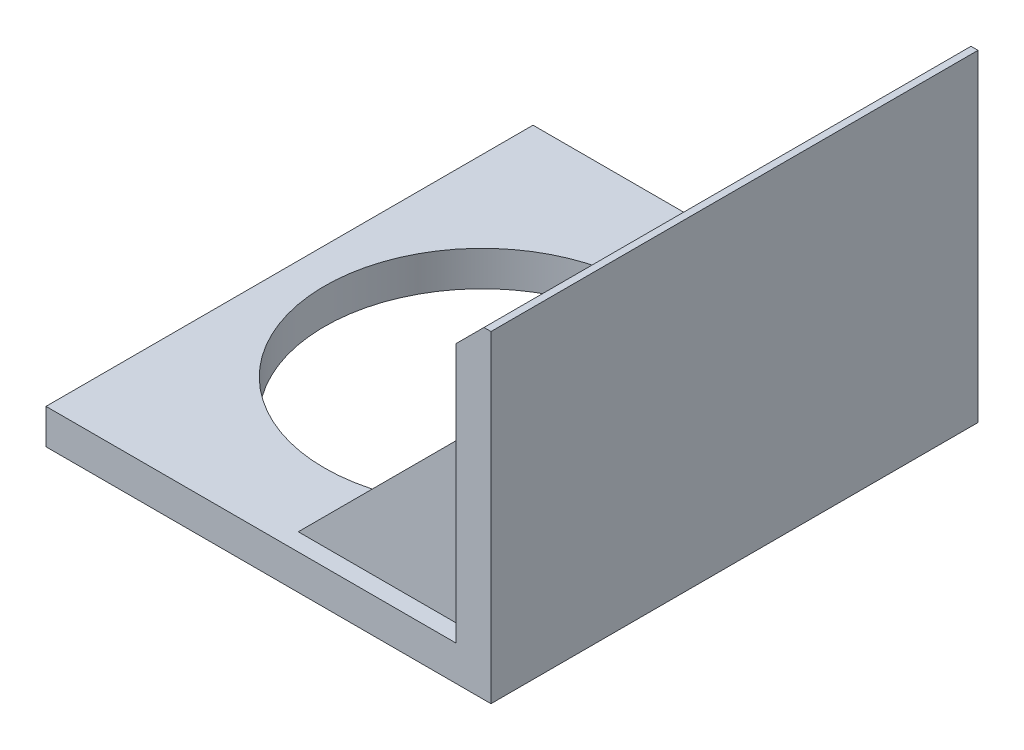
ISO-10303-21;
HEADER;
FILE_DESCRIPTION(('STEP AP214'),'2;1');
FILE_NAME('part.step','',(''),(''),'','','');
FILE_SCHEMA(('AUTOMOTIVE_DESIGN { 1 0 10303 214 1 1 1 1 }'));
ENDSEC;
DATA;
#1=APPLICATION_CONTEXT('core data for automotive mechanical design processes');
#2=APPLICATION_PROTOCOL_DEFINITION('international standard','automotive_design',2000,#1);
#3=PRODUCT_CONTEXT('',#1,'mechanical');
#4=PRODUCT('Part','Part','',(#3));
#5=PRODUCT_RELATED_PRODUCT_CATEGORY('part','',(#4));
#6=PRODUCT_DEFINITION_FORMATION('','',#4);
#7=PRODUCT_DEFINITION_CONTEXT('part definition',#1,'design');
#8=PRODUCT_DEFINITION('design','',#6,#7);
#9=PRODUCT_DEFINITION_SHAPE('','',#8);
#10=(LENGTH_UNIT() NAMED_UNIT(*) SI_UNIT(.MILLI.,.METRE.));
#11=(NAMED_UNIT(*) PLANE_ANGLE_UNIT() SI_UNIT($,.RADIAN.));
#12=(NAMED_UNIT(*) SI_UNIT($,.STERADIAN.) SOLID_ANGLE_UNIT());
#13=UNCERTAINTY_MEASURE_WITH_UNIT(LENGTH_MEASURE(1.E-05),#10,'distance_accuracy_value','');
#14=(GEOMETRIC_REPRESENTATION_CONTEXT(3) GLOBAL_UNCERTAINTY_ASSIGNED_CONTEXT((#13)) GLOBAL_UNIT_ASSIGNED_CONTEXT((#10,
#11,#12)) REPRESENTATION_CONTEXT('',''));
#15=CARTESIAN_POINT('',(0.,0.,0.));
#16=DIRECTION('',(0.,0.,1.));
#17=DIRECTION('',(1.,0.,0.));
#18=AXIS2_PLACEMENT_3D('',#15,#16,#17);
#19=CARTESIAN_POINT('',(0.,10.,0.));
#20=DIRECTION('',(0.,-1.,0.));
#21=DIRECTION('',(0.,0.,-1.));
#22=AXIS2_PLACEMENT_3D('',#19,#20,#21);
#23=PLANE('',#22);
#24=CARTESIAN_POINT('',(0.,10.,0.));
#25=DIRECTION('',(0.,1.,0.));
#26=DIRECTION('',(0.,0.,1.));
#27=AXIS2_PLACEMENT_3D('',#24,#25,#26);
#28=CIRCLE('',#27,45.);
#29=CARTESIAN_POINT('',(0.,10.,45.));
#30=VERTEX_POINT('',#29);
#31=EDGE_CURVE('E198',#30,#30,#28,.T.);
#32=ORIENTED_EDGE('',*,*,#31,.F.);
#33=EDGE_LOOP('',(#32));
#34=FACE_BOUND('',#33,.T.);
#35=DIRECTION('',(1.,0.,0.));
#36=VECTOR('',#35,1.);
#37=CARTESIAN_POINT('',(12.0000000000035,10.,-64.4999999999999));
#38=LINE('',#37,#36);
#39=CARTESIAN_POINT('',(12.0000000000035,10.,-64.4999999999999));
#40=VERTEX_POINT('',#39);
#41=CARTESIAN_POINT('',(62.0000000000035,10.,-64.4999999999999));
#42=VERTEX_POINT('',#41);
#43=EDGE_CURVE('E137',#40,#42,#38,.T.);
#44=ORIENTED_EDGE('',*,*,#43,.T.);
#45=DIRECTION('',(0.,0.,1.));
#46=VECTOR('',#45,1.);
#47=CARTESIAN_POINT('',(62.0000000000035,10.,-69.5000000000001));
#48=LINE('',#47,#46);
#49=CARTESIAN_POINT('',(62.0000000000035,10.,-69.5000000000001));
#50=VERTEX_POINT('',#49);
#51=EDGE_CURVE('E185',#50,#42,#48,.T.);
#52=ORIENTED_EDGE('',*,*,#51,.F.);
#53=DIRECTION('',(-1.,0.,0.));
#54=VECTOR('',#53,1.);
#55=CARTESIAN_POINT('',(3.49148133884313E-12,10.,-69.5000000000001));
#56=LINE('',#55,#54);
#57=CARTESIAN_POINT('',(-54.9999999999965,10.,-69.5));
#58=VERTEX_POINT('',#57);
#59=EDGE_CURVE('E204',#50,#58,#56,.T.);
#60=ORIENTED_EDGE('',*,*,#59,.T.);
#61=DIRECTION('',(0.,0.,1.));
#62=VECTOR('',#61,1.);
#63=CARTESIAN_POINT('',(-54.9999999999965,10.,-69.5));
#64=LINE('',#63,#62);
#65=CARTESIAN_POINT('',(-54.9999999999965,10.,69.5));
#66=VERTEX_POINT('',#65);
#67=EDGE_CURVE('E206',#58,#66,#64,.T.);
#68=ORIENTED_EDGE('',*,*,#67,.T.);
#69=DIRECTION('',(1.,0.,0.));
#70=VECTOR('',#69,1.);
#71=CARTESIAN_POINT('',(3.49148133884313E-12,10.,69.5000000000001));
#72=LINE('',#71,#70);
#73=CARTESIAN_POINT('',(62.0000000000035,10.,69.5000000000001));
#74=VERTEX_POINT('',#73);
#75=EDGE_CURVE('E209',#66,#74,#72,.T.);
#76=ORIENTED_EDGE('',*,*,#75,.T.);
#77=CARTESIAN_POINT('',(62.0000000000035,10.,64.5000000000001));
#78=VERTEX_POINT('',#77);
#79=EDGE_CURVE('E179',#78,#74,#48,.T.);
#80=ORIENTED_EDGE('',*,*,#79,.F.);
#81=DIRECTION('',(1.,0.,0.));
#82=VECTOR('',#81,1.);
#83=CARTESIAN_POINT('',(12.0000000000035,10.,64.5000000000001));
#84=LINE('',#83,#82);
#85=CARTESIAN_POINT('',(12.0000000000035,10.,64.5000000000001));
#86=VERTEX_POINT('',#85);
#87=EDGE_CURVE('E62',#86,#78,#84,.T.);
#88=ORIENTED_EDGE('',*,*,#87,.F.);
#89=DIRECTION('',(0.,0.,1.));
#90=VECTOR('',#89,1.);
#91=CARTESIAN_POINT('',(12.0000000000035,10.,56.5000000000001));
#92=LINE('',#91,#90);
#93=CARTESIAN_POINT('',(12.0000000000035,10.,56.5000000000001));
#94=VERTEX_POINT('',#93);
#95=EDGE_CURVE('E172',#94,#86,#92,.T.);
#96=ORIENTED_EDGE('',*,*,#95,.F.);
#97=DIRECTION('',(1.,0.,0.));
#98=VECTOR('',#97,1.);
#99=CARTESIAN_POINT('',(12.0000000000035,10.,56.5000000000001));
#100=LINE('',#99,#98);
#101=CARTESIAN_POINT('',(62.0000000000035,10.,56.5000000000001));
#102=VERTEX_POINT('',#101);
#103=EDGE_CURVE('E165',#94,#102,#100,.T.);
#104=ORIENTED_EDGE('',*,*,#103,.T.);
#105=CARTESIAN_POINT('',(62.0000000000035,10.,-56.4999999999999));
#106=VERTEX_POINT('',#105);
#107=EDGE_CURVE('E192',#106,#102,#48,.T.);
#108=ORIENTED_EDGE('',*,*,#107,.F.);
#109=DIRECTION('',(1.,0.,0.));
#110=VECTOR('',#109,1.);
#111=CARTESIAN_POINT('',(12.0000000000035,10.,-56.4999999999999));
#112=LINE('',#111,#110);
#113=CARTESIAN_POINT('',(12.0000000000035,10.,-56.4999999999999));
#114=VERTEX_POINT('',#113);
#115=EDGE_CURVE('E54',#114,#106,#112,.T.);
#116=ORIENTED_EDGE('',*,*,#115,.F.);
#117=DIRECTION('',(0.,0.,1.));
#118=VECTOR('',#117,1.);
#119=CARTESIAN_POINT('',(12.0000000000035,10.,-64.4999999999999));
#120=LINE('',#119,#118);
#121=EDGE_CURVE('E150',#40,#114,#120,.T.);
#122=ORIENTED_EDGE('',*,*,#121,.F.);
#123=EDGE_LOOP('',(#44,#52,#60,#68,#76,#80,#88,#96,#104,#108,#116,#122));
#124=FACE_BOUND('',#123,.T.);
#125=ADVANCED_FACE('F39',(#34,#124),#23,.F.);
#126=CARTESIAN_POINT('',(62.0000000000035,92.,-69.5000000000001));
#127=DIRECTION('',(1.,0.,0.));
#128=DIRECTION('',(0.,0.,-1.));
#129=AXIS2_PLACEMENT_3D('',#126,#127,#128);
#130=PLANE('',#129);
#131=DIRECTION('',(0.,1.,0.));
#132=VECTOR('',#131,1.);
#133=CARTESIAN_POINT('',(62.0000000000035,10.,-64.4999999999999));
#134=LINE('',#133,#132);
#135=CARTESIAN_POINT('',(62.0000000000035,60.,-64.4999999999999));
#136=VERTEX_POINT('',#135);
#137=EDGE_CURVE('E142',#42,#136,#134,.T.);
#138=ORIENTED_EDGE('',*,*,#137,.T.);
#139=DIRECTION('',(0.,0.,1.));
#140=VECTOR('',#139,1.);
#141=CARTESIAN_POINT('',(62.0000000000035,60.,-64.4999999999999));
#142=LINE('',#141,#140);
#143=CARTESIAN_POINT('',(62.0000000000035,60.,-56.4999999999999));
#144=VERTEX_POINT('',#143);
#145=EDGE_CURVE('E152',#136,#144,#142,.T.);
#146=ORIENTED_EDGE('',*,*,#145,.T.);
#147=DIRECTION('',(0.,1.,0.));
#148=VECTOR('',#147,1.);
#149=CARTESIAN_POINT('',(62.0000000000035,10.,-56.4999999999999));
#150=LINE('',#149,#148);
#151=EDGE_CURVE('E153',#106,#144,#150,.T.);
#152=ORIENTED_EDGE('',*,*,#151,.F.);
#153=ORIENTED_EDGE('',*,*,#107,.T.);
#154=DIRECTION('',(0.,1.,0.));
#155=VECTOR('',#154,1.);
#156=CARTESIAN_POINT('',(62.0000000000035,10.,56.5000000000001));
#157=LINE('',#156,#155);
#158=CARTESIAN_POINT('',(62.0000000000035,60.,56.5000000000001));
#159=VERTEX_POINT('',#158);
#160=EDGE_CURVE('E169',#102,#159,#157,.T.);
#161=ORIENTED_EDGE('',*,*,#160,.T.);
#162=DIRECTION('',(0.,0.,1.));
#163=VECTOR('',#162,1.);
#164=CARTESIAN_POINT('',(62.0000000000035,60.,56.5000000000001));
#165=LINE('',#164,#163);
#166=CARTESIAN_POINT('',(62.0000000000035,60.,64.5000000000001));
#167=VERTEX_POINT('',#166);
#168=EDGE_CURVE('E176',#159,#167,#165,.T.);
#169=ORIENTED_EDGE('',*,*,#168,.T.);
#170=DIRECTION('',(0.,1.,0.));
#171=VECTOR('',#170,1.);
#172=CARTESIAN_POINT('',(62.0000000000035,10.,64.5000000000001));
#173=LINE('',#172,#171);
#174=EDGE_CURVE('E166',#78,#167,#173,.T.);
#175=ORIENTED_EDGE('',*,*,#174,.F.);
#176=ORIENTED_EDGE('',*,*,#79,.T.);
#177=DIRECTION('',(0.,-1.,0.));
#178=VECTOR('',#177,1.);
#179=CARTESIAN_POINT('',(62.0000000000035,92.,69.5000000000001));
#180=LINE('',#179,#178);
#181=CARTESIAN_POINT('',(62.0000000000035,84.,69.5000000000001));
#182=VERTEX_POINT('',#181);
#183=EDGE_CURVE('E190',#182,#74,#180,.T.);
#184=ORIENTED_EDGE('',*,*,#183,.F.);
#185=DIRECTION('',(0.,0.,-1.));
#186=VECTOR('',#185,1.);
#187=CARTESIAN_POINT('',(62.0000000000035,84.,-69.5000000000001));
#188=LINE('',#187,#186);
#189=CARTESIAN_POINT('',(62.0000000000035,84.,-69.5000000000001));
#190=VERTEX_POINT('',#189);
#191=EDGE_CURVE('E47',#182,#190,#188,.T.);
#192=ORIENTED_EDGE('',*,*,#191,.T.);
#193=DIRECTION('',(0.,-1.,0.));
#194=VECTOR('',#193,1.);
#195=CARTESIAN_POINT('',(62.0000000000035,92.,-69.5000000000001));
#196=LINE('',#195,#194);
#197=EDGE_CURVE('E195',#190,#50,#196,.T.);
#198=ORIENTED_EDGE('',*,*,#197,.T.);
#199=ORIENTED_EDGE('',*,*,#51,.T.);
#200=EDGE_LOOP('',(#138,#146,#152,#153,#161,#169,#175,#176,#184,#192,#198,#199));
#201=FACE_BOUND('',#200,.T.);
#202=ADVANCED_FACE('F240',(#201),#130,.F.);
#203=CARTESIAN_POINT('',(0.,0.,0.));
#204=DIRECTION('',(0.,-1.,0.));
#205=DIRECTION('',(0.,0.,-1.));
#206=AXIS2_PLACEMENT_3D('',#203,#204,#205);
#207=PLANE('',#206);
#208=DIRECTION('',(-1.,0.,0.));
#209=VECTOR('',#208,1.);
#210=CARTESIAN_POINT('',(3.49148133884313E-12,0.,-69.5000000000001));
#211=LINE('',#210,#209);
#212=CARTESIAN_POINT('',(72.0000000000035,0.,-69.5000000000001));
#213=VERTEX_POINT('',#212);
#214=CARTESIAN_POINT('',(-54.9999999999965,0.,-69.5));
#215=VERTEX_POINT('',#214);
#216=EDGE_CURVE('E201',#213,#215,#211,.T.);
#217=ORIENTED_EDGE('',*,*,#216,.F.);
#218=DIRECTION('',(0.,0.,-1.));
#219=VECTOR('',#218,1.);
#220=CARTESIAN_POINT('',(72.0000000000035,0.,-69.5000000000001));
#221=LINE('',#220,#219);
#222=CARTESIAN_POINT('',(72.0000000000035,0.,69.5000000000001));
#223=VERTEX_POINT('',#222);
#224=EDGE_CURVE('E207',#223,#213,#221,.T.);
#225=ORIENTED_EDGE('',*,*,#224,.F.);
#226=DIRECTION('',(1.,0.,0.));
#227=VECTOR('',#226,1.);
#228=CARTESIAN_POINT('',(3.49148133884313E-12,0.,69.5000000000001));
#229=LINE('',#228,#227);
#230=CARTESIAN_POINT('',(-54.9999999999965,0.,69.5));
#231=VERTEX_POINT('',#230);
#232=EDGE_CURVE('E217',#231,#223,#229,.T.);
#233=ORIENTED_EDGE('',*,*,#232,.F.);
#234=DIRECTION('',(0.,0.,1.));
#235=VECTOR('',#234,1.);
#236=CARTESIAN_POINT('',(-54.9999999999965,0.,-69.5));
#237=LINE('',#236,#235);
#238=EDGE_CURVE('E214',#215,#231,#237,.T.);
#239=ORIENTED_EDGE('',*,*,#238,.F.);
#240=EDGE_LOOP('',(#217,#225,#233,#239));
#241=FACE_BOUND('',#240,.T.);
#242=CARTESIAN_POINT('',(0.,0.,0.));
#243=DIRECTION('',(0.,1.,0.));
#244=DIRECTION('',(0.,0.,1.));
#245=AXIS2_PLACEMENT_3D('',#242,#243,#244);
#246=CIRCLE('',#245,45.);
#247=CARTESIAN_POINT('',(0.,0.,45.));
#248=VERTEX_POINT('',#247);
#249=EDGE_CURVE('E197',#248,#248,#246,.T.);
#250=ORIENTED_EDGE('',*,*,#249,.T.);
#251=EDGE_LOOP('',(#250));
#252=FACE_BOUND('',#251,.T.);
#253=ADVANCED_FACE('F265',(#241,#252),#207,.T.);
#254=CARTESIAN_POINT('',(3.49148133884313E-12,10.,-69.5000000000001));
#255=DIRECTION('',(0.,0.,1.));
#256=DIRECTION('',(1.,0.,0.));
#257=AXIS2_PLACEMENT_3D('',#254,#255,#256);
#258=PLANE('',#257);
#259=ORIENTED_EDGE('',*,*,#197,.F.);
#260=DIRECTION('',(-0.707106781186547,-0.707106781186548,0.));
#261=VECTOR('',#260,1.);
#262=CARTESIAN_POINT('',(70.0000000000034,91.9999999999999,-69.5000000000003));
#263=LINE('',#262,#261);
#264=CARTESIAN_POINT('',(70.0000000000035,92.,-69.5000000000001));
#265=VERTEX_POINT('',#264);
#266=EDGE_CURVE('E11',#190,#265,#263,.F.);
#267=ORIENTED_EDGE('',*,*,#266,.T.);
#268=DIRECTION('',(-1.,0.,0.));
#269=VECTOR('',#268,1.);
#270=CARTESIAN_POINT('',(72.0000000000035,92.,-69.5000000000001));
#271=LINE('',#270,#269);
#272=CARTESIAN_POINT('',(72.0000000000035,92.,-69.5000000000001));
#273=VERTEX_POINT('',#272);
#274=EDGE_CURVE('E184',#273,#265,#271,.T.);
#275=ORIENTED_EDGE('',*,*,#274,.F.);
#276=DIRECTION('',(0.,-1.,0.));
#277=VECTOR('',#276,1.);
#278=CARTESIAN_POINT('',(72.0000000000035,10.,-69.5000000000001));
#279=LINE('',#278,#277);
#280=EDGE_CURVE('E212',#273,#213,#279,.T.);
#281=ORIENTED_EDGE('',*,*,#280,.T.);
#282=ORIENTED_EDGE('',*,*,#216,.T.);
#283=DIRECTION('',(0.,-1.,0.));
#284=VECTOR('',#283,1.);
#285=CARTESIAN_POINT('',(-54.9999999999965,10.,-69.5));
#286=LINE('',#285,#284);
#287=EDGE_CURVE('E229',#58,#215,#286,.T.);
#288=ORIENTED_EDGE('',*,*,#287,.F.);
#289=ORIENTED_EDGE('',*,*,#59,.F.);
#290=EDGE_LOOP('',(#259,#267,#275,#281,#282,#288,#289));
#291=FACE_BOUND('',#290,.T.);
#292=ADVANCED_FACE('F245',(#291),#258,.F.);
#293=CARTESIAN_POINT('',(-54.9999999999965,10.,-69.5));
#294=DIRECTION('',(1.,0.,0.));
#295=DIRECTION('',(0.,0.,-1.));
#296=AXIS2_PLACEMENT_3D('',#293,#294,#295);
#297=PLANE('',#296);
#298=ORIENTED_EDGE('',*,*,#238,.T.);
#299=DIRECTION('',(0.,-1.,0.));
#300=VECTOR('',#299,1.);
#301=CARTESIAN_POINT('',(-54.9999999999965,10.,69.5));
#302=LINE('',#301,#300);
#303=EDGE_CURVE('E226',#66,#231,#302,.T.);
#304=ORIENTED_EDGE('',*,*,#303,.F.);
#305=ORIENTED_EDGE('',*,*,#67,.F.);
#306=ORIENTED_EDGE('',*,*,#287,.T.);
#307=EDGE_LOOP('',(#298,#304,#305,#306));
#308=FACE_BOUND('',#307,.T.);
#309=ADVANCED_FACE('F263',(#308),#297,.F.);
#310=CARTESIAN_POINT('',(3.49148133884313E-12,10.,69.5000000000001));
#311=DIRECTION('',(0.,0.,-1.));
#312=DIRECTION('',(-1.,0.,0.));
#313=AXIS2_PLACEMENT_3D('',#310,#311,#312);
#314=PLANE('',#313);
#315=DIRECTION('',(1.,0.,0.));
#316=VECTOR('',#315,1.);
#317=CARTESIAN_POINT('',(72.0000000000035,92.,69.5000000000001));
#318=LINE('',#317,#316);
#319=CARTESIAN_POINT('',(70.0000000000035,92.,69.5000000000001));
#320=VERTEX_POINT('',#319);
#321=CARTESIAN_POINT('',(72.0000000000035,92.,69.5000000000001));
#322=VERTEX_POINT('',#321);
#323=EDGE_CURVE('E188',#320,#322,#318,.T.);
#324=ORIENTED_EDGE('',*,*,#323,.F.);
#325=DIRECTION('',(0.707106781186547,0.707106781186548,0.));
#326=VECTOR('',#325,1.);
#327=CARTESIAN_POINT('',(70.0000000000035,92.,69.5000000000001));
#328=LINE('',#327,#326);
#329=EDGE_CURVE('E235',#320,#182,#328,.F.);
#330=ORIENTED_EDGE('',*,*,#329,.T.);
#331=ORIENTED_EDGE('',*,*,#183,.T.);
#332=ORIENTED_EDGE('',*,*,#75,.F.);
#333=ORIENTED_EDGE('',*,*,#303,.T.);
#334=ORIENTED_EDGE('',*,*,#232,.T.);
#335=DIRECTION('',(0.,-1.,0.));
#336=VECTOR('',#335,1.);
#337=CARTESIAN_POINT('',(72.0000000000035,10.,69.5000000000001));
#338=LINE('',#337,#336);
#339=EDGE_CURVE('E223',#322,#223,#338,.T.);
#340=ORIENTED_EDGE('',*,*,#339,.F.);
#341=EDGE_LOOP('',(#324,#330,#331,#332,#333,#334,#340));
#342=FACE_BOUND('',#341,.T.);
#343=ADVANCED_FACE('F254',(#342),#314,.F.);
#344=CARTESIAN_POINT('',(72.0000000000035,10.,-69.5000000000001));
#345=DIRECTION('',(-1.,0.,0.));
#346=DIRECTION('',(0.,0.,1.));
#347=AXIS2_PLACEMENT_3D('',#344,#345,#346);
#348=PLANE('',#347);
#349=ORIENTED_EDGE('',*,*,#224,.T.);
#350=ORIENTED_EDGE('',*,*,#280,.F.);
#351=DIRECTION('',(0.,0.,-1.));
#352=VECTOR('',#351,1.);
#353=CARTESIAN_POINT('',(72.0000000000035,92.,-69.5000000000001));
#354=LINE('',#353,#352);
#355=EDGE_CURVE('E181',#322,#273,#354,.T.);
#356=ORIENTED_EDGE('',*,*,#355,.F.);
#357=ORIENTED_EDGE('',*,*,#339,.T.);
#358=EDGE_LOOP('',(#349,#350,#356,#357));
#359=FACE_BOUND('',#358,.T.);
#360=ADVANCED_FACE('F258',(#359),#348,.F.);
#361=CARTESIAN_POINT('',(0.,10.,0.));
#362=DIRECTION('',(0.,-1.,0.));
#363=DIRECTION('',(0.,0.,-1.));
#364=AXIS2_PLACEMENT_3D('',#361,#362,#363);
#365=CYLINDRICAL_SURFACE('',#364,45.);
#366=ORIENTED_EDGE('',*,*,#31,.T.);
#367=EDGE_LOOP('',(#366));
#368=FACE_BOUND('',#367,.T.);
#369=ORIENTED_EDGE('',*,*,#249,.F.);
#370=EDGE_LOOP('',(#369));
#371=FACE_BOUND('',#370,.T.);
#372=ADVANCED_FACE('F271',(#368,#371),#365,.F.);
#373=CARTESIAN_POINT('',(0.,92.,0.));
#374=DIRECTION('',(0.,-1.,0.));
#375=DIRECTION('',(0.,0.,-1.));
#376=AXIS2_PLACEMENT_3D('',#373,#374,#375);
#377=PLANE('',#376);
#378=ORIENTED_EDGE('',*,*,#274,.T.);
#379=DIRECTION('',(0.,0.,1.));
#380=VECTOR('',#379,1.);
#381=CARTESIAN_POINT('',(70.0000000000035,92.,0.));
#382=LINE('',#381,#380);
#383=EDGE_CURVE('E232',#265,#320,#382,.T.);
#384=ORIENTED_EDGE('',*,*,#383,.T.);
#385=ORIENTED_EDGE('',*,*,#323,.T.);
#386=ORIENTED_EDGE('',*,*,#355,.T.);
#387=EDGE_LOOP('',(#378,#384,#385,#386));
#388=FACE_BOUND('',#387,.T.);
#389=ADVANCED_FACE('F251',(#388),#377,.F.);
#390=CARTESIAN_POINT('',(70.0000000000035,92.,0.));
#391=DIRECTION('',(0.707106781186548,-0.707106781186547,0.));
#392=DIRECTION('',(0.,0.,1.));
#393=AXIS2_PLACEMENT_3D('',#390,#391,#392);
#394=PLANE('',#393);
#395=ORIENTED_EDGE('',*,*,#266,.F.);
#396=ORIENTED_EDGE('',*,*,#191,.F.);
#397=ORIENTED_EDGE('',*,*,#329,.F.);
#398=ORIENTED_EDGE('',*,*,#383,.F.);
#399=EDGE_LOOP('',(#395,#396,#397,#398));
#400=FACE_BOUND('',#399,.T.);
#401=ADVANCED_FACE('F41',(#400),#394,.F.);
#402=CARTESIAN_POINT('',(62.0000000000035,60.,56.5000000000001));
#403=DIRECTION('',(-0.707106781186548,0.707106781186547,0.));
#404=DIRECTION('',(-0.707106781186547,-0.707106781186548,0.));
#405=AXIS2_PLACEMENT_3D('',#402,#403,#404);
#406=PLANE('',#405);
#407=DIRECTION('',(-0.707106781186547,-0.707106781186548,0.));
#408=VECTOR('',#407,1.);
#409=CARTESIAN_POINT('',(62.0000000000035,60.,64.5000000000001));
#410=LINE('',#409,#408);
#411=EDGE_CURVE('E157',#167,#86,#410,.T.);
#412=ORIENTED_EDGE('',*,*,#411,.F.);
#413=ORIENTED_EDGE('',*,*,#168,.F.);
#414=DIRECTION('',(-0.707106781186547,-0.707106781186548,0.));
#415=VECTOR('',#414,1.);
#416=CARTESIAN_POINT('',(62.0000000000035,60.,56.5000000000001));
#417=LINE('',#416,#415);
#418=EDGE_CURVE('E162',#159,#94,#417,.T.);
#419=ORIENTED_EDGE('',*,*,#418,.T.);
#420=ORIENTED_EDGE('',*,*,#95,.T.);
#421=EDGE_LOOP('',(#412,#413,#419,#420));
#422=FACE_BOUND('',#421,.T.);
#423=ADVANCED_FACE('F315',(#422),#406,.T.);
#424=CARTESIAN_POINT('',(0.,0.,56.5000000000001));
#425=DIRECTION('',(0.,0.,1.));
#426=DIRECTION('',(1.,0.,0.));
#427=AXIS2_PLACEMENT_3D('',#424,#425,#426);
#428=PLANE('',#427);
#429=ORIENTED_EDGE('',*,*,#418,.F.);
#430=ORIENTED_EDGE('',*,*,#160,.F.);
#431=ORIENTED_EDGE('',*,*,#103,.F.);
#432=EDGE_LOOP('',(#429,#430,#431));
#433=FACE_BOUND('',#432,.T.);
#434=ADVANCED_FACE('F321',(#433),#428,.F.);
#435=CARTESIAN_POINT('',(0.,0.,64.5000000000001));
#436=DIRECTION('',(0.,0.,1.));
#437=DIRECTION('',(1.,0.,0.));
#438=AXIS2_PLACEMENT_3D('',#435,#436,#437);
#439=PLANE('',#438);
#440=ORIENTED_EDGE('',*,*,#411,.T.);
#441=ORIENTED_EDGE('',*,*,#87,.T.);
#442=ORIENTED_EDGE('',*,*,#174,.T.);
#443=EDGE_LOOP('',(#440,#441,#442));
#444=FACE_BOUND('',#443,.T.);
#445=ADVANCED_FACE('F328',(#444),#439,.T.);
#446=CARTESIAN_POINT('',(62.0000000000035,60.,-64.4999999999999));
#447=DIRECTION('',(-0.707106781186548,0.707106781186547,0.));
#448=DIRECTION('',(-0.707106781186547,-0.707106781186548,0.));
#449=AXIS2_PLACEMENT_3D('',#446,#447,#448);
#450=PLANE('',#449);
#451=DIRECTION('',(-0.707106781186547,-0.707106781186548,0.));
#452=VECTOR('',#451,1.);
#453=CARTESIAN_POINT('',(62.0000000000035,60.,-56.4999999999999));
#454=LINE('',#453,#452);
#455=EDGE_CURVE('E363',#144,#114,#454,.T.);
#456=ORIENTED_EDGE('',*,*,#455,.F.);
#457=ORIENTED_EDGE('',*,*,#145,.F.);
#458=DIRECTION('',(-0.707106781186547,-0.707106781186548,0.));
#459=VECTOR('',#458,1.);
#460=CARTESIAN_POINT('',(62.0000000000035,60.,-64.4999999999999));
#461=LINE('',#460,#459);
#462=EDGE_CURVE('E140',#136,#40,#461,.T.);
#463=ORIENTED_EDGE('',*,*,#462,.T.);
#464=ORIENTED_EDGE('',*,*,#121,.T.);
#465=EDGE_LOOP('',(#456,#457,#463,#464));
#466=FACE_BOUND('',#465,.T.);
#467=ADVANCED_FACE('F149',(#466),#450,.T.);
#468=CARTESIAN_POINT('',(0.,0.,-64.4999999999999));
#469=DIRECTION('',(0.,0.,1.));
#470=DIRECTION('',(1.,0.,0.));
#471=AXIS2_PLACEMENT_3D('',#468,#469,#470);
#472=PLANE('',#471);
#473=ORIENTED_EDGE('',*,*,#462,.F.);
#474=ORIENTED_EDGE('',*,*,#137,.F.);
#475=ORIENTED_EDGE('',*,*,#43,.F.);
#476=EDGE_LOOP('',(#473,#474,#475));
#477=FACE_BOUND('',#476,.T.);
#478=ADVANCED_FACE('F139',(#477),#472,.F.);
#479=CARTESIAN_POINT('',(0.,0.,-56.4999999999999));
#480=DIRECTION('',(0.,0.,1.));
#481=DIRECTION('',(1.,0.,0.));
#482=AXIS2_PLACEMENT_3D('',#479,#480,#481);
#483=PLANE('',#482);
#484=ORIENTED_EDGE('',*,*,#455,.T.);
#485=ORIENTED_EDGE('',*,*,#115,.T.);
#486=ORIENTED_EDGE('',*,*,#151,.T.);
#487=EDGE_LOOP('',(#484,#485,#486));
#488=FACE_BOUND('',#487,.T.);
#489=ADVANCED_FACE('F355',(#488),#483,.T.);
#490=CLOSED_SHELL('',(#125,#202,#253,#292,#309,#343,#360,#372,#389,#401,#423,#434,#445,#467,
#478,#489));
#491=MANIFOLD_SOLID_BREP('B2',#490);
#492=ADVANCED_BREP_SHAPE_REPRESENTATION('',(#18,#491),#14);
#493=SHAPE_DEFINITION_REPRESENTATION(#9,#492);
ENDSEC;
END-ISO-10303-21;
